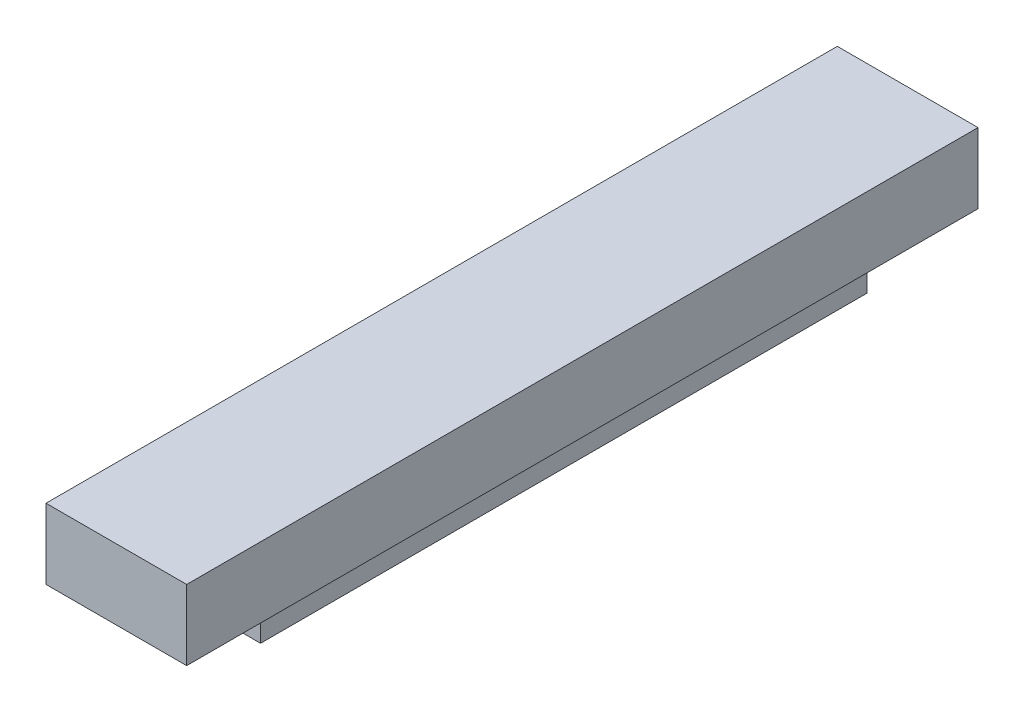
ISO-10303-21;
HEADER;
FILE_DESCRIPTION(('STEP AP214'),'2;1');
FILE_NAME('part.step','',(''),(''),'','','');
FILE_SCHEMA(('AUTOMOTIVE_DESIGN { 1 0 10303 214 1 1 1 1 }'));
ENDSEC;
DATA;
#1=APPLICATION_CONTEXT('core data for automotive mechanical design processes');
#2=APPLICATION_PROTOCOL_DEFINITION('international standard','automotive_design',2000,#1);
#3=PRODUCT_CONTEXT('',#1,'mechanical');
#4=PRODUCT('Part','Part','',(#3));
#5=PRODUCT_RELATED_PRODUCT_CATEGORY('part','',(#4));
#6=PRODUCT_DEFINITION_FORMATION('','',#4);
#7=PRODUCT_DEFINITION_CONTEXT('part definition',#1,'design');
#8=PRODUCT_DEFINITION('design','',#6,#7);
#9=PRODUCT_DEFINITION_SHAPE('','',#8);
#10=(LENGTH_UNIT() NAMED_UNIT(*) SI_UNIT(.MILLI.,.METRE.));
#11=(NAMED_UNIT(*) PLANE_ANGLE_UNIT() SI_UNIT($,.RADIAN.));
#12=(NAMED_UNIT(*) SI_UNIT($,.STERADIAN.) SOLID_ANGLE_UNIT());
#13=UNCERTAINTY_MEASURE_WITH_UNIT(LENGTH_MEASURE(1.E-05),#10,'distance_accuracy_value','');
#14=(GEOMETRIC_REPRESENTATION_CONTEXT(3) GLOBAL_UNCERTAINTY_ASSIGNED_CONTEXT((#13)) GLOBAL_UNIT_ASSIGNED_CONTEXT((#10,
#11,#12)) REPRESENTATION_CONTEXT('',''));
#15=CARTESIAN_POINT('',(0.,0.,0.));
#16=DIRECTION('',(0.,0.,1.));
#17=DIRECTION('',(1.,0.,0.));
#18=AXIS2_PLACEMENT_3D('',#15,#16,#17);
#19=CARTESIAN_POINT('',(0.,4.,0.));
#20=DIRECTION('',(1.,0.,0.));
#21=DIRECTION('',(0.,0.,-1.));
#22=AXIS2_PLACEMENT_3D('',#19,#20,#21);
#23=PLANE('',#22);
#24=DIRECTION('',(0.,0.,1.));
#25=VECTOR('',#24,1.);
#26=CARTESIAN_POINT('',(0.,0.,0.));
#27=LINE('',#26,#25);
#28=CARTESIAN_POINT('',(0.,0.,-45.));
#29=VERTEX_POINT('',#28);
#30=CARTESIAN_POINT('',(0.,0.,-41.7));
#31=VERTEX_POINT('',#30);
#32=EDGE_CURVE('E121',#29,#31,#27,.T.);
#33=ORIENTED_EDGE('',*,*,#32,.T.);
#34=DIRECTION('',(0.,1.,0.));
#35=VECTOR('',#34,1.);
#36=CARTESIAN_POINT('',(0.,-4.,-41.7));
#37=LINE('',#36,#35);
#38=CARTESIAN_POINT('',(0.,-4.,-41.7));
#39=VERTEX_POINT('',#38);
#40=EDGE_CURVE('E102',#39,#31,#37,.T.);
#41=ORIENTED_EDGE('',*,*,#40,.F.);
#42=DIRECTION('',(0.,0.,-1.));
#43=VECTOR('',#42,1.);
#44=CARTESIAN_POINT('',(0.,-4.,-7.2));
#45=LINE('',#44,#43);
#46=CARTESIAN_POINT('',(0.,-4.,-7.2));
#47=VERTEX_POINT('',#46);
#48=EDGE_CURVE('E108',#47,#39,#45,.T.);
#49=ORIENTED_EDGE('',*,*,#48,.F.);
#50=DIRECTION('',(0.,1.,0.));
#51=VECTOR('',#50,1.);
#52=CARTESIAN_POINT('',(0.,-4.,-7.2));
#53=LINE('',#52,#51);
#54=CARTESIAN_POINT('',(0.,0.,-7.2));
#55=VERTEX_POINT('',#54);
#56=EDGE_CURVE('E134',#47,#55,#53,.T.);
#57=ORIENTED_EDGE('',*,*,#56,.T.);
#58=CARTESIAN_POINT('',(0.,0.,0.));
#59=VERTEX_POINT('',#58);
#60=EDGE_CURVE('E54',#55,#59,#27,.T.);
#61=ORIENTED_EDGE('',*,*,#60,.T.);
#62=DIRECTION('',(0.,-1.,0.));
#63=VECTOR('',#62,1.);
#64=CARTESIAN_POINT('',(0.,4.,0.));
#65=LINE('',#64,#63);
#66=CARTESIAN_POINT('',(0.,4.,0.));
#67=VERTEX_POINT('',#66);
#68=EDGE_CURVE('E11',#67,#59,#65,.T.);
#69=ORIENTED_EDGE('',*,*,#68,.F.);
#70=DIRECTION('',(0.,0.,1.));
#71=VECTOR('',#70,1.);
#72=CARTESIAN_POINT('',(0.,4.,0.));
#73=LINE('',#72,#71);
#74=CARTESIAN_POINT('',(0.,4.,-45.));
#75=VERTEX_POINT('',#74);
#76=EDGE_CURVE('E141',#75,#67,#73,.T.);
#77=ORIENTED_EDGE('',*,*,#76,.F.);
#78=DIRECTION('',(0.,-1.,0.));
#79=VECTOR('',#78,1.);
#80=CARTESIAN_POINT('',(0.,4.,-45.));
#81=LINE('',#80,#79);
#82=EDGE_CURVE('E151',#75,#29,#81,.T.);
#83=ORIENTED_EDGE('',*,*,#82,.T.);
#84=EDGE_LOOP('',(#33,#41,#49,#57,#61,#69,#77,#83));
#85=FACE_BOUND('',#84,.T.);
#86=ADVANCED_FACE('F33',(#85),#23,.F.);
#87=CARTESIAN_POINT('',(0.,4.,0.));
#88=DIRECTION('',(0.,0.,-1.));
#89=DIRECTION('',(-1.,0.,0.));
#90=AXIS2_PLACEMENT_3D('',#87,#88,#89);
#91=PLANE('',#90);
#92=DIRECTION('',(1.,0.,0.));
#93=VECTOR('',#92,1.);
#94=CARTESIAN_POINT('',(0.,0.,0.));
#95=LINE('',#94,#93);
#96=CARTESIAN_POINT('',(8.,0.,0.));
#97=VERTEX_POINT('',#96);
#98=EDGE_CURVE('E154',#59,#97,#95,.T.);
#99=ORIENTED_EDGE('',*,*,#98,.T.);
#100=DIRECTION('',(0.,-1.,0.));
#101=VECTOR('',#100,1.);
#102=CARTESIAN_POINT('',(8.,4.,0.));
#103=LINE('',#102,#101);
#104=CARTESIAN_POINT('',(8.,4.,0.));
#105=VERTEX_POINT('',#104);
#106=EDGE_CURVE('E41',#105,#97,#103,.T.);
#107=ORIENTED_EDGE('',*,*,#106,.F.);
#108=DIRECTION('',(1.,0.,0.));
#109=VECTOR('',#108,1.);
#110=CARTESIAN_POINT('',(0.,4.,0.));
#111=LINE('',#110,#109);
#112=EDGE_CURVE('E144',#67,#105,#111,.T.);
#113=ORIENTED_EDGE('',*,*,#112,.F.);
#114=ORIENTED_EDGE('',*,*,#68,.T.);
#115=EDGE_LOOP('',(#99,#107,#113,#114));
#116=FACE_BOUND('',#115,.T.);
#117=ADVANCED_FACE('F171',(#116),#91,.F.);
#118=CARTESIAN_POINT('',(8.,4.,0.));
#119=DIRECTION('',(-1.,0.,0.));
#120=DIRECTION('',(0.,0.,1.));
#121=AXIS2_PLACEMENT_3D('',#118,#119,#120);
#122=PLANE('',#121);
#123=DIRECTION('',(0.,0.,-1.));
#124=VECTOR('',#123,1.);
#125=CARTESIAN_POINT('',(8.,0.,0.));
#126=LINE('',#125,#124);
#127=CARTESIAN_POINT('',(8.,0.,-45.));
#128=VERTEX_POINT('',#127);
#129=EDGE_CURVE('E165',#97,#128,#126,.T.);
#130=ORIENTED_EDGE('',*,*,#129,.T.);
#131=DIRECTION('',(0.,-1.,0.));
#132=VECTOR('',#131,1.);
#133=CARTESIAN_POINT('',(8.,4.,-45.));
#134=LINE('',#133,#132);
#135=CARTESIAN_POINT('',(8.,4.,-45.));
#136=VERTEX_POINT('',#135);
#137=EDGE_CURVE('E161',#136,#128,#134,.T.);
#138=ORIENTED_EDGE('',*,*,#137,.F.);
#139=DIRECTION('',(0.,0.,-1.));
#140=VECTOR('',#139,1.);
#141=CARTESIAN_POINT('',(8.,4.,0.));
#142=LINE('',#141,#140);
#143=EDGE_CURVE('E147',#105,#136,#142,.T.);
#144=ORIENTED_EDGE('',*,*,#143,.F.);
#145=ORIENTED_EDGE('',*,*,#106,.T.);
#146=EDGE_LOOP('',(#130,#138,#144,#145));
#147=FACE_BOUND('',#146,.T.);
#148=ADVANCED_FACE('F174',(#147),#122,.F.);
#149=CARTESIAN_POINT('',(0.,4.,-45.));
#150=DIRECTION('',(0.,0.,1.));
#151=DIRECTION('',(1.,0.,0.));
#152=AXIS2_PLACEMENT_3D('',#149,#150,#151);
#153=PLANE('',#152);
#154=DIRECTION('',(-1.,0.,0.));
#155=VECTOR('',#154,1.);
#156=CARTESIAN_POINT('',(0.,0.,-45.));
#157=LINE('',#156,#155);
#158=EDGE_CURVE('E145',#128,#29,#157,.T.);
#159=ORIENTED_EDGE('',*,*,#158,.T.);
#160=ORIENTED_EDGE('',*,*,#82,.F.);
#161=DIRECTION('',(-1.,0.,0.));
#162=VECTOR('',#161,1.);
#163=CARTESIAN_POINT('',(0.,4.,-45.));
#164=LINE('',#163,#162);
#165=EDGE_CURVE('E149',#136,#75,#164,.T.);
#166=ORIENTED_EDGE('',*,*,#165,.F.);
#167=ORIENTED_EDGE('',*,*,#137,.T.);
#168=EDGE_LOOP('',(#159,#160,#166,#167));
#169=FACE_BOUND('',#168,.T.);
#170=ADVANCED_FACE('F179',(#169),#153,.F.);
#171=CARTESIAN_POINT('',(0.,4.,0.));
#172=DIRECTION('',(0.,-1.,0.));
#173=DIRECTION('',(0.,0.,-1.));
#174=AXIS2_PLACEMENT_3D('',#171,#172,#173);
#175=PLANE('',#174);
#176=ORIENTED_EDGE('',*,*,#76,.T.);
#177=ORIENTED_EDGE('',*,*,#112,.T.);
#178=ORIENTED_EDGE('',*,*,#143,.T.);
#179=ORIENTED_EDGE('',*,*,#165,.T.);
#180=EDGE_LOOP('',(#176,#177,#178,#179));
#181=FACE_BOUND('',#180,.T.);
#182=ADVANCED_FACE('F183',(#181),#175,.F.);
#183=CARTESIAN_POINT('',(0.,0.,0.));
#184=DIRECTION('',(0.,-1.,0.));
#185=DIRECTION('',(0.,0.,-1.));
#186=AXIS2_PLACEMENT_3D('',#183,#184,#185);
#187=PLANE('',#186);
#188=DIRECTION('',(-1.,0.,0.));
#189=VECTOR('',#188,1.);
#190=CARTESIAN_POINT('',(0.,0.,-7.2));
#191=LINE('',#190,#189);
#192=CARTESIAN_POINT('',(5.,0.,-7.2));
#193=VERTEX_POINT('',#192);
#194=EDGE_CURVE('E49',#193,#55,#191,.T.);
#195=ORIENTED_EDGE('',*,*,#194,.F.);
#196=DIRECTION('',(0.,0.,1.));
#197=VECTOR('',#196,1.);
#198=CARTESIAN_POINT('',(5.,0.,-7.2));
#199=LINE('',#198,#197);
#200=CARTESIAN_POINT('',(5.,0.,-41.7));
#201=VERTEX_POINT('',#200);
#202=EDGE_CURVE('E133',#201,#193,#199,.T.);
#203=ORIENTED_EDGE('',*,*,#202,.F.);
#204=DIRECTION('',(1.,0.,0.));
#205=VECTOR('',#204,1.);
#206=CARTESIAN_POINT('',(0.,0.,-41.7));
#207=LINE('',#206,#205);
#208=EDGE_CURVE('E263',#31,#201,#207,.T.);
#209=ORIENTED_EDGE('',*,*,#208,.F.);
#210=ORIENTED_EDGE('',*,*,#32,.F.);
#211=ORIENTED_EDGE('',*,*,#158,.F.);
#212=ORIENTED_EDGE('',*,*,#129,.F.);
#213=ORIENTED_EDGE('',*,*,#98,.F.);
#214=ORIENTED_EDGE('',*,*,#60,.F.);
#215=EDGE_LOOP('',(#195,#203,#209,#210,#211,#212,#213,#214));
#216=FACE_BOUND('',#215,.T.);
#217=ADVANCED_FACE('F176',(#216),#187,.T.);
#218=CARTESIAN_POINT('',(0.,-4.,-41.7));
#219=DIRECTION('',(0.,0.,1.));
#220=DIRECTION('',(1.,0.,0.));
#221=AXIS2_PLACEMENT_3D('',#218,#219,#220);
#222=PLANE('',#221);
#223=ORIENTED_EDGE('',*,*,#208,.T.);
#224=DIRECTION('',(0.,1.,0.));
#225=VECTOR('',#224,1.);
#226=CARTESIAN_POINT('',(5.,-4.,-41.7));
#227=LINE('',#226,#225);
#228=CARTESIAN_POINT('',(5.,-4.,-41.7));
#229=VERTEX_POINT('',#228);
#230=EDGE_CURVE('E104',#229,#201,#227,.T.);
#231=ORIENTED_EDGE('',*,*,#230,.F.);
#232=DIRECTION('',(1.,0.,0.));
#233=VECTOR('',#232,1.);
#234=CARTESIAN_POINT('',(0.,-4.,-41.7));
#235=LINE('',#234,#233);
#236=EDGE_CURVE('E97',#39,#229,#235,.T.);
#237=ORIENTED_EDGE('',*,*,#236,.F.);
#238=ORIENTED_EDGE('',*,*,#40,.T.);
#239=EDGE_LOOP('',(#223,#231,#237,#238));
#240=FACE_BOUND('',#239,.T.);
#241=ADVANCED_FACE('F100',(#240),#222,.F.);
#242=CARTESIAN_POINT('',(5.,-4.,-7.2));
#243=DIRECTION('',(-1.,0.,0.));
#244=DIRECTION('',(0.,0.,1.));
#245=AXIS2_PLACEMENT_3D('',#242,#243,#244);
#246=PLANE('',#245);
#247=ORIENTED_EDGE('',*,*,#202,.T.);
#248=DIRECTION('',(0.,1.,0.));
#249=VECTOR('',#248,1.);
#250=CARTESIAN_POINT('',(5.,-4.,-7.2));
#251=LINE('',#250,#249);
#252=CARTESIAN_POINT('',(5.,-4.,-7.2));
#253=VERTEX_POINT('',#252);
#254=EDGE_CURVE('E124',#253,#193,#251,.T.);
#255=ORIENTED_EDGE('',*,*,#254,.F.);
#256=DIRECTION('',(0.,0.,1.));
#257=VECTOR('',#256,1.);
#258=CARTESIAN_POINT('',(5.,-4.,-7.2));
#259=LINE('',#258,#257);
#260=EDGE_CURVE('E107',#229,#253,#259,.T.);
#261=ORIENTED_EDGE('',*,*,#260,.F.);
#262=ORIENTED_EDGE('',*,*,#230,.T.);
#263=EDGE_LOOP('',(#247,#255,#261,#262));
#264=FACE_BOUND('',#263,.T.);
#265=ADVANCED_FACE('F231',(#264),#246,.F.);
#266=CARTESIAN_POINT('',(0.,-4.,-7.2));
#267=DIRECTION('',(0.,0.,-1.));
#268=DIRECTION('',(-1.,0.,0.));
#269=AXIS2_PLACEMENT_3D('',#266,#267,#268);
#270=PLANE('',#269);
#271=ORIENTED_EDGE('',*,*,#194,.T.);
#272=ORIENTED_EDGE('',*,*,#56,.F.);
#273=DIRECTION('',(-1.,0.,0.));
#274=VECTOR('',#273,1.);
#275=CARTESIAN_POINT('',(0.,-4.,-7.2));
#276=LINE('',#275,#274);
#277=EDGE_CURVE('E113',#253,#47,#276,.T.);
#278=ORIENTED_EDGE('',*,*,#277,.F.);
#279=ORIENTED_EDGE('',*,*,#254,.T.);
#280=EDGE_LOOP('',(#271,#272,#278,#279));
#281=FACE_BOUND('',#280,.T.);
#282=ADVANCED_FACE('F239',(#281),#270,.F.);
#283=CARTESIAN_POINT('',(0.,-4.,0.));
#284=DIRECTION('',(0.,-1.,0.));
#285=DIRECTION('',(0.,0.,-1.));
#286=AXIS2_PLACEMENT_3D('',#283,#284,#285);
#287=PLANE('',#286);
#288=ORIENTED_EDGE('',*,*,#48,.T.);
#289=ORIENTED_EDGE('',*,*,#236,.T.);
#290=ORIENTED_EDGE('',*,*,#260,.T.);
#291=ORIENTED_EDGE('',*,*,#277,.T.);
#292=EDGE_LOOP('',(#288,#289,#290,#291));
#293=FACE_BOUND('',#292,.T.);
#294=ADVANCED_FACE('F111',(#293),#287,.T.);
#295=CLOSED_SHELL('',(#86,#117,#148,#170,#182,#217,#241,#265,#282,#294));
#296=MANIFOLD_SOLID_BREP('B2',#295);
#297=ADVANCED_BREP_SHAPE_REPRESENTATION('',(#18,#296),#14);
#298=SHAPE_DEFINITION_REPRESENTATION(#9,#297);
ENDSEC;
END-ISO-10303-21;
